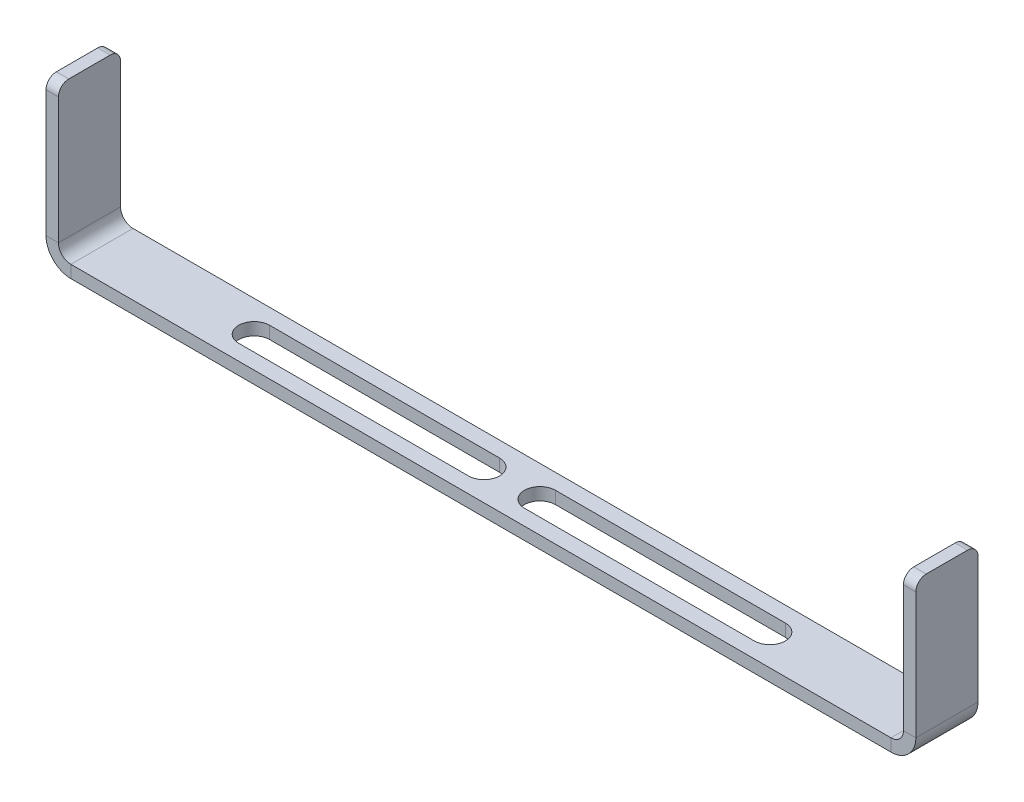
ISO-10303-21;
HEADER;
FILE_DESCRIPTION(('STEP AP214'),'2;1');
FILE_NAME('part.step','',(''),(''),'','','');
FILE_SCHEMA(('AUTOMOTIVE_DESIGN { 1 0 10303 214 1 1 1 1 }'));
ENDSEC;
DATA;
#1=APPLICATION_CONTEXT('core data for automotive mechanical design processes');
#2=APPLICATION_PROTOCOL_DEFINITION('international standard','automotive_design',2000,#1);
#3=PRODUCT_CONTEXT('',#1,'mechanical');
#4=PRODUCT('Part','Part','',(#3));
#5=PRODUCT_RELATED_PRODUCT_CATEGORY('part','',(#4));
#6=PRODUCT_DEFINITION_FORMATION('','',#4);
#7=PRODUCT_DEFINITION_CONTEXT('part definition',#1,'design');
#8=PRODUCT_DEFINITION('design','',#6,#7);
#9=PRODUCT_DEFINITION_SHAPE('','',#8);
#10=(LENGTH_UNIT() NAMED_UNIT(*) SI_UNIT(.MILLI.,.METRE.));
#11=(NAMED_UNIT(*) PLANE_ANGLE_UNIT() SI_UNIT($,.RADIAN.));
#12=(NAMED_UNIT(*) SI_UNIT($,.STERADIAN.) SOLID_ANGLE_UNIT());
#13=UNCERTAINTY_MEASURE_WITH_UNIT(LENGTH_MEASURE(1.E-05),#10,'distance_accuracy_value','');
#14=(GEOMETRIC_REPRESENTATION_CONTEXT(3) GLOBAL_UNCERTAINTY_ASSIGNED_CONTEXT((#13)) GLOBAL_UNIT_ASSIGNED_CONTEXT((#10,
#11,#12)) REPRESENTATION_CONTEXT('',''));
#15=CARTESIAN_POINT('',(0.,0.,0.));
#16=DIRECTION('',(0.,0.,1.));
#17=DIRECTION('',(1.,0.,0.));
#18=AXIS2_PLACEMENT_3D('',#15,#16,#17);
#19=CARTESIAN_POINT('',(-198.,0.,15.));
#20=DIRECTION('',(0.,0.,1.));
#21=DIRECTION('',(1.,0.,0.));
#22=AXIS2_PLACEMENT_3D('',#19,#20,#21);
#23=PLANE('',#22);
#24=DIRECTION('',(0.,-1.,0.));
#25=VECTOR('',#24,1.);
#26=CARTESIAN_POINT('',(-198.,0.,15.));
#27=LINE('',#26,#25);
#28=CARTESIAN_POINT('',(-198.,0.,15.));
#29=VERTEX_POINT('',#28);
#30=CARTESIAN_POINT('',(-198.,-6.00000000000005,15.));
#31=VERTEX_POINT('',#30);
#32=EDGE_CURVE('E377',#29,#31,#27,.T.);
#33=ORIENTED_EDGE('',*,*,#32,.F.);
#34=CARTESIAN_POINT('',(-198.,5.99999999999995,15.));
#35=DIRECTION('',(0.,0.,-1.));
#36=DIRECTION('',(-1.,0.,0.));
#37=AXIS2_PLACEMENT_3D('',#34,#35,#36);
#38=CIRCLE('',#37,6.);
#39=CARTESIAN_POINT('',(-204.,5.99999999999995,15.));
#40=VERTEX_POINT('',#39);
#41=EDGE_CURVE('E285',#40,#29,#38,.F.);
#42=ORIENTED_EDGE('',*,*,#41,.F.);
#43=DIRECTION('',(1.,0.,0.));
#44=VECTOR('',#43,1.);
#45=CARTESIAN_POINT('',(-210.,5.99999999999995,15.));
#46=LINE('',#45,#44);
#47=CARTESIAN_POINT('',(-210.,5.99999999999995,15.));
#48=VERTEX_POINT('',#47);
#49=EDGE_CURVE('E374',#48,#40,#46,.T.);
#50=ORIENTED_EDGE('',*,*,#49,.F.);
#51=CARTESIAN_POINT('',(-198.,5.99999999999995,15.));
#52=DIRECTION('',(0.,0.,1.));
#53=DIRECTION('',(1.,0.,0.));
#54=AXIS2_PLACEMENT_3D('',#51,#52,#53);
#55=CIRCLE('',#54,12.);
#56=EDGE_CURVE('E292',#48,#31,#55,.T.);
#57=ORIENTED_EDGE('',*,*,#56,.T.);
#58=EDGE_LOOP('',(#33,#42,#50,#57));
#59=FACE_BOUND('',#58,.T.);
#60=ADVANCED_FACE('F38',(#59),#23,.T.);
#61=CARTESIAN_POINT('',(-210.,5.99999999999995,15.));
#62=DIRECTION('',(0.,0.,1.));
#63=DIRECTION('',(1.,0.,0.));
#64=AXIS2_PLACEMENT_3D('',#61,#62,#63);
#65=PLANE('',#64);
#66=DIRECTION('',(1.,0.,0.));
#67=VECTOR('',#66,1.);
#68=CARTESIAN_POINT('',(204.,0.,15.));
#69=LINE('',#68,#67);
#70=CARTESIAN_POINT('',(198.,0.,15.));
#71=VERTEX_POINT('',#70);
#72=EDGE_CURVE('E282',#29,#71,#69,.T.);
#73=ORIENTED_EDGE('',*,*,#72,.F.);
#74=ORIENTED_EDGE('',*,*,#32,.T.);
#75=DIRECTION('',(1.,0.,0.));
#76=VECTOR('',#75,1.);
#77=CARTESIAN_POINT('',(204.,-6.00000000000005,15.));
#78=LINE('',#77,#76);
#79=CARTESIAN_POINT('',(198.,-6.00000000000005,15.));
#80=VERTEX_POINT('',#79);
#81=EDGE_CURVE('E295',#31,#80,#78,.T.);
#82=ORIENTED_EDGE('',*,*,#81,.T.);
#83=DIRECTION('',(0.,1.,0.));
#84=VECTOR('',#83,1.);
#85=CARTESIAN_POINT('',(198.,-6.00000000000005,15.));
#86=LINE('',#85,#84);
#87=EDGE_CURVE('E365',#80,#71,#86,.T.);
#88=ORIENTED_EDGE('',*,*,#87,.T.);
#89=EDGE_LOOP('',(#73,#74,#82,#88));
#90=FACE_BOUND('',#89,.T.);
#91=ADVANCED_FACE('F444',(#90),#65,.T.);
#92=CARTESIAN_POINT('',(-204.,5.99999999999995,-15.));
#93=DIRECTION('',(0.,0.,-1.));
#94=DIRECTION('',(-1.,0.,0.));
#95=AXIS2_PLACEMENT_3D('',#92,#93,#94);
#96=PLANE('',#95);
#97=DIRECTION('',(-1.,0.,0.));
#98=VECTOR('',#97,1.);
#99=CARTESIAN_POINT('',(-204.,5.99999999999995,-15.));
#100=LINE('',#99,#98);
#101=CARTESIAN_POINT('',(-204.,5.99999999999995,-15.));
#102=VERTEX_POINT('',#101);
#103=CARTESIAN_POINT('',(-210.,5.99999999999995,-15.));
#104=VERTEX_POINT('',#103);
#105=EDGE_CURVE('E371',#102,#104,#100,.T.);
#106=ORIENTED_EDGE('',*,*,#105,.F.);
#107=CARTESIAN_POINT('',(-198.,5.99999999999995,-15.));
#108=DIRECTION('',(0.,0.,-1.));
#109=DIRECTION('',(-1.,0.,0.));
#110=AXIS2_PLACEMENT_3D('',#107,#108,#109);
#111=CIRCLE('',#110,6.);
#112=CARTESIAN_POINT('',(-198.,0.,-15.));
#113=VERTEX_POINT('',#112);
#114=EDGE_CURVE('E313',#102,#113,#111,.F.);
#115=ORIENTED_EDGE('',*,*,#114,.T.);
#116=DIRECTION('',(0.,1.,0.));
#117=VECTOR('',#116,1.);
#118=CARTESIAN_POINT('',(-198.,-6.00000000000005,-15.));
#119=LINE('',#118,#117);
#120=CARTESIAN_POINT('',(-198.,-6.00000000000005,-15.));
#121=VERTEX_POINT('',#120);
#122=EDGE_CURVE('E369',#121,#113,#119,.T.);
#123=ORIENTED_EDGE('',*,*,#122,.F.);
#124=CARTESIAN_POINT('',(-198.,5.99999999999995,-15.));
#125=DIRECTION('',(0.,0.,1.));
#126=DIRECTION('',(1.,0.,0.));
#127=AXIS2_PLACEMENT_3D('',#124,#125,#126);
#128=CIRCLE('',#127,12.);
#129=EDGE_CURVE('E320',#104,#121,#128,.T.);
#130=ORIENTED_EDGE('',*,*,#129,.F.);
#131=EDGE_LOOP('',(#106,#115,#123,#130));
#132=FACE_BOUND('',#131,.T.);
#133=ADVANCED_FACE('F503',(#132),#96,.T.);
#134=CARTESIAN_POINT('',(-198.,-6.00000000000005,-15.));
#135=DIRECTION('',(0.,0.,-1.));
#136=DIRECTION('',(-1.,0.,0.));
#137=AXIS2_PLACEMENT_3D('',#134,#135,#136);
#138=PLANE('',#137);
#139=DIRECTION('',(0.,1.,0.));
#140=VECTOR('',#139,1.);
#141=CARTESIAN_POINT('',(-210.,0.,-15.));
#142=LINE('',#141,#140);
#143=CARTESIAN_POINT('',(-210.,66.9999999999999,-15.));
#144=VERTEX_POINT('',#143);
#145=EDGE_CURVE('E318',#144,#104,#142,.F.);
#146=ORIENTED_EDGE('',*,*,#145,.F.);
#147=DIRECTION('',(1.,0.,0.));
#148=VECTOR('',#147,1.);
#149=CARTESIAN_POINT('',(-198.,66.9999999999999,-15.));
#150=LINE('',#149,#148);
#151=CARTESIAN_POINT('',(-204.,66.9999999999999,-15.));
#152=VERTEX_POINT('',#151);
#153=EDGE_CURVE('E397',#144,#152,#150,.T.);
#154=ORIENTED_EDGE('',*,*,#153,.T.);
#155=DIRECTION('',(0.,-1.,0.));
#156=VECTOR('',#155,1.);
#157=CARTESIAN_POINT('',(-204.,0.,-15.));
#158=LINE('',#157,#156);
#159=EDGE_CURVE('E316',#152,#102,#158,.T.);
#160=ORIENTED_EDGE('',*,*,#159,.T.);
#161=ORIENTED_EDGE('',*,*,#105,.T.);
#162=EDGE_LOOP('',(#146,#154,#160,#161));
#163=FACE_BOUND('',#162,.T.);
#164=ADVANCED_FACE('F417',(#163),#138,.T.);
#165=CARTESIAN_POINT('',(204.,5.99999999999995,15.));
#166=DIRECTION('',(0.,0.,1.));
#167=DIRECTION('',(1.,0.,0.));
#168=AXIS2_PLACEMENT_3D('',#165,#166,#167);
#169=PLANE('',#168);
#170=DIRECTION('',(1.,0.,0.));
#171=VECTOR('',#170,1.);
#172=CARTESIAN_POINT('',(204.,5.99999999999995,15.));
#173=LINE('',#172,#171);
#174=CARTESIAN_POINT('',(204.,5.99999999999995,15.));
#175=VERTEX_POINT('',#174);
#176=CARTESIAN_POINT('',(210.,5.99999999999995,15.));
#177=VERTEX_POINT('',#176);
#178=EDGE_CURVE('E367',#175,#177,#173,.T.);
#179=ORIENTED_EDGE('',*,*,#178,.F.);
#180=CARTESIAN_POINT('',(198.,5.99999999999995,15.));
#181=DIRECTION('',(0.,0.,-1.));
#182=DIRECTION('',(-1.,0.,0.));
#183=AXIS2_PLACEMENT_3D('',#180,#181,#182);
#184=CIRCLE('',#183,6.);
#185=EDGE_CURVE('E279',#71,#175,#184,.F.);
#186=ORIENTED_EDGE('',*,*,#185,.F.);
#187=ORIENTED_EDGE('',*,*,#87,.F.);
#188=CARTESIAN_POINT('',(198.,5.99999999999995,15.));
#189=DIRECTION('',(0.,0.,1.));
#190=DIRECTION('',(1.,0.,0.));
#191=AXIS2_PLACEMENT_3D('',#188,#189,#190);
#192=CIRCLE('',#191,12.);
#193=EDGE_CURVE('E298',#80,#177,#192,.T.);
#194=ORIENTED_EDGE('',*,*,#193,.T.);
#195=EDGE_LOOP('',(#179,#186,#187,#194));
#196=FACE_BOUND('',#195,.T.);
#197=ADVANCED_FACE('F453',(#196),#169,.T.);
#198=CARTESIAN_POINT('',(198.,-6.00000000000005,15.));
#199=DIRECTION('',(0.,0.,1.));
#200=DIRECTION('',(1.,0.,0.));
#201=AXIS2_PLACEMENT_3D('',#198,#199,#200);
#202=PLANE('',#201);
#203=DIRECTION('',(0.,1.,0.));
#204=VECTOR('',#203,1.);
#205=CARTESIAN_POINT('',(210.,0.,15.));
#206=LINE('',#205,#204);
#207=CARTESIAN_POINT('',(210.,66.9999999999999,15.));
#208=VERTEX_POINT('',#207);
#209=EDGE_CURVE('E272',#177,#208,#206,.T.);
#210=ORIENTED_EDGE('',*,*,#209,.T.);
#211=DIRECTION('',(1.,0.,0.));
#212=VECTOR('',#211,1.);
#213=CARTESIAN_POINT('',(198.,66.9999999999999,15.));
#214=LINE('',#213,#212);
#215=CARTESIAN_POINT('',(204.,66.9999999999999,15.));
#216=VERTEX_POINT('',#215);
#217=EDGE_CURVE('E395',#208,#216,#214,.F.);
#218=ORIENTED_EDGE('',*,*,#217,.T.);
#219=DIRECTION('',(0.,1.,0.));
#220=VECTOR('',#219,1.);
#221=CARTESIAN_POINT('',(204.,0.,15.));
#222=LINE('',#221,#220);
#223=EDGE_CURVE('E275',#175,#216,#222,.T.);
#224=ORIENTED_EDGE('',*,*,#223,.F.);
#225=ORIENTED_EDGE('',*,*,#178,.T.);
#226=EDGE_LOOP('',(#210,#218,#224,#225));
#227=FACE_BOUND('',#226,.T.);
#228=ADVANCED_FACE('F463',(#227),#202,.T.);
#229=CARTESIAN_POINT('',(198.,0.,-15.));
#230=DIRECTION('',(0.,0.,-1.));
#231=DIRECTION('',(-1.,0.,0.));
#232=AXIS2_PLACEMENT_3D('',#229,#230,#231);
#233=PLANE('',#232);
#234=DIRECTION('',(0.,-1.,0.));
#235=VECTOR('',#234,1.);
#236=CARTESIAN_POINT('',(198.,0.,-15.));
#237=LINE('',#236,#235);
#238=CARTESIAN_POINT('',(198.,0.,-15.));
#239=VERTEX_POINT('',#238);
#240=CARTESIAN_POINT('',(198.,-6.00000000000005,-15.));
#241=VERTEX_POINT('',#240);
#242=EDGE_CURVE('E363',#239,#241,#237,.T.);
#243=ORIENTED_EDGE('',*,*,#242,.F.);
#244=CARTESIAN_POINT('',(198.,5.99999999999995,-15.));
#245=DIRECTION('',(0.,0.,-1.));
#246=DIRECTION('',(-1.,0.,0.));
#247=AXIS2_PLACEMENT_3D('',#244,#245,#246);
#248=CIRCLE('',#247,6.);
#249=CARTESIAN_POINT('',(204.,5.99999999999995,-15.));
#250=VERTEX_POINT('',#249);
#251=EDGE_CURVE('E307',#239,#250,#248,.F.);
#252=ORIENTED_EDGE('',*,*,#251,.T.);
#253=DIRECTION('',(-1.,0.,0.));
#254=VECTOR('',#253,1.);
#255=CARTESIAN_POINT('',(210.,5.99999999999995,-15.));
#256=LINE('',#255,#254);
#257=CARTESIAN_POINT('',(210.,5.99999999999995,-15.));
#258=VERTEX_POINT('',#257);
#259=EDGE_CURVE('E361',#258,#250,#256,.T.);
#260=ORIENTED_EDGE('',*,*,#259,.F.);
#261=CARTESIAN_POINT('',(198.,5.99999999999995,-15.));
#262=DIRECTION('',(0.,0.,1.));
#263=DIRECTION('',(1.,0.,0.));
#264=AXIS2_PLACEMENT_3D('',#261,#262,#263);
#265=CIRCLE('',#264,12.);
#266=EDGE_CURVE('E276',#241,#258,#265,.T.);
#267=ORIENTED_EDGE('',*,*,#266,.F.);
#268=EDGE_LOOP('',(#243,#252,#260,#267));
#269=FACE_BOUND('',#268,.T.);
#270=ADVANCED_FACE('F483',(#269),#233,.T.);
#271=CARTESIAN_POINT('',(210.,5.99999999999995,-15.));
#272=DIRECTION('',(0.,0.,-1.));
#273=DIRECTION('',(-1.,0.,0.));
#274=AXIS2_PLACEMENT_3D('',#271,#272,#273);
#275=PLANE('',#274);
#276=DIRECTION('',(1.,0.,0.));
#277=VECTOR('',#276,1.);
#278=CARTESIAN_POINT('',(204.,0.,-15.));
#279=LINE('',#278,#277);
#280=EDGE_CURVE('E310',#113,#239,#279,.T.);
#281=ORIENTED_EDGE('',*,*,#280,.T.);
#282=ORIENTED_EDGE('',*,*,#242,.T.);
#283=DIRECTION('',(1.,0.,0.));
#284=VECTOR('',#283,1.);
#285=CARTESIAN_POINT('',(204.,-6.00000000000005,-15.));
#286=LINE('',#285,#284);
#287=EDGE_CURVE('E323',#121,#241,#286,.T.);
#288=ORIENTED_EDGE('',*,*,#287,.F.);
#289=ORIENTED_EDGE('',*,*,#122,.T.);
#290=EDGE_LOOP('',(#281,#282,#288,#289));
#291=FACE_BOUND('',#290,.T.);
#292=ADVANCED_FACE('F489',(#291),#275,.T.);
#293=CARTESIAN_POINT('',(210.,0.,15.));
#294=DIRECTION('',(-1.,0.,0.));
#295=DIRECTION('',(0.,0.,1.));
#296=AXIS2_PLACEMENT_3D('',#293,#294,#295);
#297=PLANE('',#296);
#298=DIRECTION('',(0.,1.,0.));
#299=VECTOR('',#298,1.);
#300=CARTESIAN_POINT('',(210.,0.,-15.));
#301=LINE('',#300,#299);
#302=CARTESIAN_POINT('',(210.,66.9999999999999,-15.));
#303=VERTEX_POINT('',#302);
#304=EDGE_CURVE('E271',#258,#303,#301,.T.);
#305=ORIENTED_EDGE('',*,*,#304,.T.);
#306=CARTESIAN_POINT('',(210.,66.9999999999999,-10.));
#307=DIRECTION('',(-1.,0.,0.));
#308=DIRECTION('',(0.,0.,1.));
#309=AXIS2_PLACEMENT_3D('',#306,#307,#308);
#310=CIRCLE('',#309,5.);
#311=CARTESIAN_POINT('',(210.,71.9999999999999,-10.));
#312=VERTEX_POINT('',#311);
#313=EDGE_CURVE('E384',#303,#312,#310,.F.);
#314=ORIENTED_EDGE('',*,*,#313,.T.);
#315=DIRECTION('',(0.,0.,-1.));
#316=VECTOR('',#315,1.);
#317=CARTESIAN_POINT('',(210.,71.9999999999999,15.));
#318=LINE('',#317,#316);
#319=CARTESIAN_POINT('',(210.,71.9999999999999,10.));
#320=VERTEX_POINT('',#319);
#321=EDGE_CURVE('E358',#320,#312,#318,.T.);
#322=ORIENTED_EDGE('',*,*,#321,.F.);
#323=CARTESIAN_POINT('',(210.,66.9999999999999,10.));
#324=DIRECTION('',(-1.,0.,0.));
#325=DIRECTION('',(0.,0.,1.));
#326=AXIS2_PLACEMENT_3D('',#323,#324,#325);
#327=CIRCLE('',#326,5.);
#328=EDGE_CURVE('E382',#320,#208,#327,.F.);
#329=ORIENTED_EDGE('',*,*,#328,.T.);
#330=ORIENTED_EDGE('',*,*,#209,.F.);
#331=DIRECTION('',(0.,0.,-1.));
#332=VECTOR('',#331,1.);
#333=CARTESIAN_POINT('',(210.,5.99999999999995,15.));
#334=LINE('',#333,#332);
#335=EDGE_CURVE('E301',#177,#258,#334,.T.);
#336=ORIENTED_EDGE('',*,*,#335,.T.);
#337=EDGE_LOOP('',(#305,#314,#322,#329,#330,#336));
#338=FACE_BOUND('',#337,.T.);
#339=ADVANCED_FACE('F487',(#338),#297,.F.);
#340=CARTESIAN_POINT('',(204.,71.9999999999999,15.));
#341=DIRECTION('',(0.,1.,0.));
#342=DIRECTION('',(0.,0.,1.));
#343=AXIS2_PLACEMENT_3D('',#340,#341,#342);
#344=PLANE('',#343);
#345=ORIENTED_EDGE('',*,*,#321,.T.);
#346=DIRECTION('',(1.,0.,0.));
#347=VECTOR('',#346,1.);
#348=CARTESIAN_POINT('',(204.,71.9999999999999,-10.));
#349=LINE('',#348,#347);
#350=CARTESIAN_POINT('',(204.,71.9999999999999,-10.));
#351=VERTEX_POINT('',#350);
#352=EDGE_CURVE('E389',#312,#351,#349,.F.);
#353=ORIENTED_EDGE('',*,*,#352,.T.);
#354=DIRECTION('',(0.,0.,-1.));
#355=VECTOR('',#354,1.);
#356=CARTESIAN_POINT('',(204.,71.9999999999999,15.));
#357=LINE('',#356,#355);
#358=CARTESIAN_POINT('',(204.,71.9999999999999,10.));
#359=VERTEX_POINT('',#358);
#360=EDGE_CURVE('E355',#359,#351,#357,.T.);
#361=ORIENTED_EDGE('',*,*,#360,.F.);
#362=DIRECTION('',(1.,0.,0.));
#363=VECTOR('',#362,1.);
#364=CARTESIAN_POINT('',(204.,71.9999999999999,10.));
#365=LINE('',#364,#363);
#366=EDGE_CURVE('E386',#359,#320,#365,.T.);
#367=ORIENTED_EDGE('',*,*,#366,.T.);
#368=EDGE_LOOP('',(#345,#353,#361,#367));
#369=FACE_BOUND('',#368,.T.);
#370=ADVANCED_FACE('F472',(#369),#344,.T.);
#371=CARTESIAN_POINT('',(204.,0.,15.));
#372=DIRECTION('',(-1.,0.,0.));
#373=DIRECTION('',(0.,0.,1.));
#374=AXIS2_PLACEMENT_3D('',#371,#372,#373);
#375=PLANE('',#374);
#376=ORIENTED_EDGE('',*,*,#360,.T.);
#377=CARTESIAN_POINT('',(204.,66.9999999999999,-10.));
#378=DIRECTION('',(-1.,0.,0.));
#379=DIRECTION('',(0.,0.,1.));
#380=AXIS2_PLACEMENT_3D('',#377,#378,#379);
#381=CIRCLE('',#380,5.);
#382=CARTESIAN_POINT('',(204.,66.9999999999999,-15.));
#383=VERTEX_POINT('',#382);
#384=EDGE_CURVE('E393',#351,#383,#381,.T.);
#385=ORIENTED_EDGE('',*,*,#384,.T.);
#386=DIRECTION('',(0.,1.,0.));
#387=VECTOR('',#386,1.);
#388=CARTESIAN_POINT('',(204.,0.,-15.));
#389=LINE('',#388,#387);
#390=EDGE_CURVE('E304',#250,#383,#389,.T.);
#391=ORIENTED_EDGE('',*,*,#390,.F.);
#392=DIRECTION('',(0.,0.,-1.));
#393=VECTOR('',#392,1.);
#394=CARTESIAN_POINT('',(204.,5.99999999999995,15.));
#395=LINE('',#394,#393);
#396=EDGE_CURVE('E352',#175,#250,#395,.T.);
#397=ORIENTED_EDGE('',*,*,#396,.F.);
#398=ORIENTED_EDGE('',*,*,#223,.T.);
#399=CARTESIAN_POINT('',(204.,66.9999999999999,10.));
#400=DIRECTION('',(-1.,0.,0.));
#401=DIRECTION('',(0.,0.,1.));
#402=AXIS2_PLACEMENT_3D('',#399,#400,#401);
#403=CIRCLE('',#402,5.);
#404=EDGE_CURVE('E391',#216,#359,#403,.T.);
#405=ORIENTED_EDGE('',*,*,#404,.T.);
#406=EDGE_LOOP('',(#376,#385,#391,#397,#398,#405));
#407=FACE_BOUND('',#406,.T.);
#408=ADVANCED_FACE('F461',(#407),#375,.T.);
#409=CARTESIAN_POINT('',(198.,5.99999999999995,15.));
#410=DIRECTION('',(0.,0.,-1.));
#411=DIRECTION('',(-1.,0.,0.));
#412=AXIS2_PLACEMENT_3D('',#409,#410,#411);
#413=CYLINDRICAL_SURFACE('',#412,6.);
#414=ORIENTED_EDGE('',*,*,#251,.F.);
#415=DIRECTION('',(0.,0.,-1.));
#416=VECTOR('',#415,1.);
#417=CARTESIAN_POINT('',(198.,0.,15.));
#418=LINE('',#417,#416);
#419=EDGE_CURVE('E349',#71,#239,#418,.T.);
#420=ORIENTED_EDGE('',*,*,#419,.F.);
#421=ORIENTED_EDGE('',*,*,#185,.T.);
#422=ORIENTED_EDGE('',*,*,#396,.T.);
#423=EDGE_LOOP('',(#414,#420,#421,#422));
#424=FACE_BOUND('',#423,.T.);
#425=ADVANCED_FACE('F452',(#424),#413,.F.);
#426=CARTESIAN_POINT('',(204.,0.,15.));
#427=DIRECTION('',(0.,1.,0.));
#428=DIRECTION('',(0.,0.,1.));
#429=AXIS2_PLACEMENT_3D('',#426,#427,#428);
#430=PLANE('',#429);
#431=CARTESIAN_POINT('',(13.5,0.,0.));
#432=DIRECTION('',(0.,1.,0.));
#433=DIRECTION('',(0.,0.,1.));
#434=AXIS2_PLACEMENT_3D('',#431,#432,#433);
#435=CIRCLE('',#434,7.5);
#436=CARTESIAN_POINT('',(13.5,0.,-7.5));
#437=VERTEX_POINT('',#436);
#438=CARTESIAN_POINT('',(13.5,0.,7.5));
#439=VERTEX_POINT('',#438);
#440=EDGE_CURVE('E269',#437,#439,#435,.T.);
#441=ORIENTED_EDGE('',*,*,#440,.F.);
#442=DIRECTION('',(-1.,0.,0.));
#443=VECTOR('',#442,1.);
#444=CARTESIAN_POINT('',(204.,0.,-7.5));
#445=LINE('',#444,#443);
#446=CARTESIAN_POINT('',(124.5,0.,-7.5));
#447=VERTEX_POINT('',#446);
#448=EDGE_CURVE('E264',#447,#437,#445,.T.);
#449=ORIENTED_EDGE('',*,*,#448,.F.);
#450=CARTESIAN_POINT('',(124.5,0.,0.));
#451=DIRECTION('',(0.,1.,0.));
#452=DIRECTION('',(0.,0.,1.));
#453=AXIS2_PLACEMENT_3D('',#450,#451,#452);
#454=CIRCLE('',#453,7.5);
#455=CARTESIAN_POINT('',(124.5,0.,7.5));
#456=VERTEX_POINT('',#455);
#457=EDGE_CURVE('E208',#456,#447,#454,.T.);
#458=ORIENTED_EDGE('',*,*,#457,.F.);
#459=DIRECTION('',(1.,0.,0.));
#460=VECTOR('',#459,1.);
#461=CARTESIAN_POINT('',(204.,0.,7.5));
#462=LINE('',#461,#460);
#463=EDGE_CURVE('E267',#439,#456,#462,.T.);
#464=ORIENTED_EDGE('',*,*,#463,.F.);
#465=EDGE_LOOP('',(#441,#449,#458,#464));
#466=FACE_BOUND('',#465,.T.);
#467=CARTESIAN_POINT('',(-13.5,0.,0.));
#468=DIRECTION('',(0.,1.,0.));
#469=DIRECTION('',(0.,0.,1.));
#470=AXIS2_PLACEMENT_3D('',#467,#468,#469);
#471=CIRCLE('',#470,7.5);
#472=CARTESIAN_POINT('',(-13.5,0.,7.5));
#473=VERTEX_POINT('',#472);
#474=CARTESIAN_POINT('',(-13.5,0.,-7.5));
#475=VERTEX_POINT('',#474);
#476=EDGE_CURVE('E262',#473,#475,#471,.T.);
#477=ORIENTED_EDGE('',*,*,#476,.F.);
#478=DIRECTION('',(1.,0.,0.));
#479=VECTOR('',#478,1.);
#480=CARTESIAN_POINT('',(204.,0.,7.5));
#481=LINE('',#480,#479);
#482=CARTESIAN_POINT('',(-124.5,0.,7.5));
#483=VERTEX_POINT('',#482);
#484=EDGE_CURVE('E233',#483,#473,#481,.T.);
#485=ORIENTED_EDGE('',*,*,#484,.F.);
#486=CARTESIAN_POINT('',(-124.5,0.,0.));
#487=DIRECTION('',(0.,1.,0.));
#488=DIRECTION('',(0.,0.,1.));
#489=AXIS2_PLACEMENT_3D('',#486,#487,#488);
#490=CIRCLE('',#489,7.5);
#491=CARTESIAN_POINT('',(-124.5,0.,-7.5));
#492=VERTEX_POINT('',#491);
#493=EDGE_CURVE('E257',#492,#483,#490,.T.);
#494=ORIENTED_EDGE('',*,*,#493,.F.);
#495=DIRECTION('',(-1.,0.,0.));
#496=VECTOR('',#495,1.);
#497=CARTESIAN_POINT('',(204.,0.,-7.5));
#498=LINE('',#497,#496);
#499=EDGE_CURVE('E260',#475,#492,#498,.T.);
#500=ORIENTED_EDGE('',*,*,#499,.F.);
#501=EDGE_LOOP('',(#477,#485,#494,#500));
#502=FACE_BOUND('',#501,.T.);
#503=ORIENTED_EDGE('',*,*,#280,.F.);
#504=DIRECTION('',(0.,0.,-1.));
#505=VECTOR('',#504,1.);
#506=CARTESIAN_POINT('',(-198.,0.,15.));
#507=LINE('',#506,#505);
#508=EDGE_CURVE('E346',#29,#113,#507,.T.);
#509=ORIENTED_EDGE('',*,*,#508,.F.);
#510=ORIENTED_EDGE('',*,*,#72,.T.);
#511=ORIENTED_EDGE('',*,*,#419,.T.);
#512=EDGE_LOOP('',(#503,#509,#510,#511));
#513=FACE_BOUND('',#512,.T.);
#514=ADVANCED_FACE('F443',(#466,#502,#513),#430,.T.);
#515=CARTESIAN_POINT('',(-198.,5.99999999999995,15.));
#516=DIRECTION('',(0.,0.,-1.));
#517=DIRECTION('',(-1.,0.,0.));
#518=AXIS2_PLACEMENT_3D('',#515,#516,#517);
#519=CYLINDRICAL_SURFACE('',#518,6.);
#520=ORIENTED_EDGE('',*,*,#114,.F.);
#521=DIRECTION('',(0.,0.,-1.));
#522=VECTOR('',#521,1.);
#523=CARTESIAN_POINT('',(-204.,5.99999999999995,15.));
#524=LINE('',#523,#522);
#525=EDGE_CURVE('E343',#40,#102,#524,.T.);
#526=ORIENTED_EDGE('',*,*,#525,.F.);
#527=ORIENTED_EDGE('',*,*,#41,.T.);
#528=ORIENTED_EDGE('',*,*,#508,.T.);
#529=EDGE_LOOP('',(#520,#526,#527,#528));
#530=FACE_BOUND('',#529,.T.);
#531=ADVANCED_FACE('F435',(#530),#519,.F.);
#532=CARTESIAN_POINT('',(-204.,0.,15.));
#533=DIRECTION('',(1.,0.,0.));
#534=DIRECTION('',(0.,0.,-1.));
#535=AXIS2_PLACEMENT_3D('',#532,#533,#534);
#536=PLANE('',#535);
#537=ORIENTED_EDGE('',*,*,#159,.F.);
#538=CARTESIAN_POINT('',(-204.,66.9999999999999,-10.));
#539=DIRECTION('',(1.,0.,0.));
#540=DIRECTION('',(0.,0.,-1.));
#541=AXIS2_PLACEMENT_3D('',#538,#539,#540);
#542=CIRCLE('',#541,5.);
#543=CARTESIAN_POINT('',(-204.,71.9999999999999,-10.));
#544=VERTEX_POINT('',#543);
#545=EDGE_CURVE('E402',#152,#544,#542,.T.);
#546=ORIENTED_EDGE('',*,*,#545,.T.);
#547=DIRECTION('',(0.,0.,-1.));
#548=VECTOR('',#547,1.);
#549=CARTESIAN_POINT('',(-204.,71.9999999999999,15.));
#550=LINE('',#549,#548);
#551=CARTESIAN_POINT('',(-204.,71.9999999999999,10.));
#552=VERTEX_POINT('',#551);
#553=EDGE_CURVE('E341',#552,#544,#550,.T.);
#554=ORIENTED_EDGE('',*,*,#553,.F.);
#555=CARTESIAN_POINT('',(-204.,66.9999999999999,10.));
#556=DIRECTION('',(1.,0.,0.));
#557=DIRECTION('',(0.,0.,-1.));
#558=AXIS2_PLACEMENT_3D('',#555,#556,#557);
#559=CIRCLE('',#558,5.);
#560=CARTESIAN_POINT('',(-204.,66.9999999999999,15.));
#561=VERTEX_POINT('',#560);
#562=EDGE_CURVE('E400',#552,#561,#559,.T.);
#563=ORIENTED_EDGE('',*,*,#562,.T.);
#564=DIRECTION('',(0.,-1.,0.));
#565=VECTOR('',#564,1.);
#566=CARTESIAN_POINT('',(-204.,0.,15.));
#567=LINE('',#566,#565);
#568=EDGE_CURVE('E288',#561,#40,#567,.T.);
#569=ORIENTED_EDGE('',*,*,#568,.T.);
#570=ORIENTED_EDGE('',*,*,#525,.T.);
#571=EDGE_LOOP('',(#537,#546,#554,#563,#569,#570));
#572=FACE_BOUND('',#571,.T.);
#573=ADVANCED_FACE('F423',(#572),#536,.T.);
#574=CARTESIAN_POINT('',(-210.,71.9999999999999,15.));
#575=DIRECTION('',(0.,1.,0.));
#576=DIRECTION('',(0.,0.,1.));
#577=AXIS2_PLACEMENT_3D('',#574,#575,#576);
#578=PLANE('',#577);
#579=ORIENTED_EDGE('',*,*,#553,.T.);
#580=DIRECTION('',(1.,0.,0.));
#581=VECTOR('',#580,1.);
#582=CARTESIAN_POINT('',(-210.,71.9999999999999,-10.));
#583=LINE('',#582,#581);
#584=CARTESIAN_POINT('',(-210.,71.9999999999999,-10.));
#585=VERTEX_POINT('',#584);
#586=EDGE_CURVE('E59',#544,#585,#583,.F.);
#587=ORIENTED_EDGE('',*,*,#586,.T.);
#588=DIRECTION('',(0.,0.,-1.));
#589=VECTOR('',#588,1.);
#590=CARTESIAN_POINT('',(-210.,71.9999999999999,15.));
#591=LINE('',#590,#589);
#592=CARTESIAN_POINT('',(-210.,71.9999999999999,10.));
#593=VERTEX_POINT('',#592);
#594=EDGE_CURVE('E339',#593,#585,#591,.T.);
#595=ORIENTED_EDGE('',*,*,#594,.F.);
#596=DIRECTION('',(1.,0.,0.));
#597=VECTOR('',#596,1.);
#598=CARTESIAN_POINT('',(-204.,71.9999999999999,10.));
#599=LINE('',#598,#597);
#600=EDGE_CURVE('E404',#593,#552,#599,.T.);
#601=ORIENTED_EDGE('',*,*,#600,.T.);
#602=EDGE_LOOP('',(#579,#587,#595,#601));
#603=FACE_BOUND('',#602,.T.);
#604=ADVANCED_FACE('F424',(#603),#578,.T.);
#605=CARTESIAN_POINT('',(-210.,0.,15.));
#606=DIRECTION('',(1.,0.,0.));
#607=DIRECTION('',(0.,0.,-1.));
#608=AXIS2_PLACEMENT_3D('',#605,#606,#607);
#609=PLANE('',#608);
#610=ORIENTED_EDGE('',*,*,#594,.T.);
#611=CARTESIAN_POINT('',(-210.,66.9999999999999,-10.));
#612=DIRECTION('',(1.,0.,0.));
#613=DIRECTION('',(0.,0.,-1.));
#614=AXIS2_PLACEMENT_3D('',#611,#612,#613);
#615=CIRCLE('',#614,5.);
#616=EDGE_CURVE('E46',#585,#144,#615,.F.);
#617=ORIENTED_EDGE('',*,*,#616,.T.);
#618=ORIENTED_EDGE('',*,*,#145,.T.);
#619=DIRECTION('',(0.,0.,-1.));
#620=VECTOR('',#619,1.);
#621=CARTESIAN_POINT('',(-210.,5.99999999999995,15.));
#622=LINE('',#621,#620);
#623=EDGE_CURVE('E336',#48,#104,#622,.T.);
#624=ORIENTED_EDGE('',*,*,#623,.F.);
#625=DIRECTION('',(0.,1.,0.));
#626=VECTOR('',#625,1.);
#627=CARTESIAN_POINT('',(-210.,0.,15.));
#628=LINE('',#627,#626);
#629=CARTESIAN_POINT('',(-210.,66.9999999999999,15.));
#630=VERTEX_POINT('',#629);
#631=EDGE_CURVE('E290',#630,#48,#628,.F.);
#632=ORIENTED_EDGE('',*,*,#631,.F.);
#633=CARTESIAN_POINT('',(-210.,66.9999999999999,10.));
#634=DIRECTION('',(1.,0.,0.));
#635=DIRECTION('',(0.,0.,-1.));
#636=AXIS2_PLACEMENT_3D('',#633,#634,#635);
#637=CIRCLE('',#636,5.);
#638=EDGE_CURVE('E408',#630,#593,#637,.F.);
#639=ORIENTED_EDGE('',*,*,#638,.T.);
#640=EDGE_LOOP('',(#610,#617,#618,#624,#632,#639));
#641=FACE_BOUND('',#640,.T.);
#642=ADVANCED_FACE('F412',(#641),#609,.F.);
#643=CARTESIAN_POINT('',(-198.,5.99999999999995,15.));
#644=DIRECTION('',(0.,0.,-1.));
#645=DIRECTION('',(-1.,0.,0.));
#646=AXIS2_PLACEMENT_3D('',#643,#644,#645);
#647=CYLINDRICAL_SURFACE('',#646,12.);
#648=ORIENTED_EDGE('',*,*,#129,.T.);
#649=DIRECTION('',(0.,0.,-1.));
#650=VECTOR('',#649,1.);
#651=CARTESIAN_POINT('',(-198.,-6.00000000000005,15.));
#652=LINE('',#651,#650);
#653=EDGE_CURVE('E333',#31,#121,#652,.T.);
#654=ORIENTED_EDGE('',*,*,#653,.F.);
#655=ORIENTED_EDGE('',*,*,#56,.F.);
#656=ORIENTED_EDGE('',*,*,#623,.T.);
#657=EDGE_LOOP('',(#648,#654,#655,#656));
#658=FACE_BOUND('',#657,.T.);
#659=ADVANCED_FACE('F566',(#658),#647,.T.);
#660=CARTESIAN_POINT('',(204.,-6.00000000000005,15.));
#661=DIRECTION('',(0.,1.,0.));
#662=DIRECTION('',(0.,0.,1.));
#663=AXIS2_PLACEMENT_3D('',#660,#661,#662);
#664=PLANE('',#663);
#665=DIRECTION('',(1.,0.,0.));
#666=VECTOR('',#665,1.);
#667=CARTESIAN_POINT('',(13.5,-6.00000000000005,-7.5));
#668=LINE('',#667,#666);
#669=CARTESIAN_POINT('',(13.5,-6.00000000000005,-7.5));
#670=VERTEX_POINT('',#669);
#671=CARTESIAN_POINT('',(124.5,-6.00000000000005,-7.5));
#672=VERTEX_POINT('',#671);
#673=EDGE_CURVE('E216',#670,#672,#668,.T.);
#674=ORIENTED_EDGE('',*,*,#673,.F.);
#675=CARTESIAN_POINT('',(13.5,-6.00000000000005,0.));
#676=DIRECTION('',(0.,-1.,0.));
#677=DIRECTION('',(0.,0.,-1.));
#678=AXIS2_PLACEMENT_3D('',#675,#676,#677);
#679=CIRCLE('',#678,7.5);
#680=CARTESIAN_POINT('',(13.5,-6.00000000000005,7.5));
#681=VERTEX_POINT('',#680);
#682=EDGE_CURVE('E221',#681,#670,#679,.T.);
#683=ORIENTED_EDGE('',*,*,#682,.F.);
#684=DIRECTION('',(-1.,0.,0.));
#685=VECTOR('',#684,1.);
#686=CARTESIAN_POINT('',(13.5,-6.00000000000005,7.5));
#687=LINE('',#686,#685);
#688=CARTESIAN_POINT('',(124.5,-6.00000000000005,7.5));
#689=VERTEX_POINT('',#688);
#690=EDGE_CURVE('E226',#689,#681,#687,.T.);
#691=ORIENTED_EDGE('',*,*,#690,.F.);
#692=CARTESIAN_POINT('',(124.5,-6.00000000000005,0.));
#693=DIRECTION('',(0.,-1.,0.));
#694=DIRECTION('',(0.,0.,-1.));
#695=AXIS2_PLACEMENT_3D('',#692,#693,#694);
#696=CIRCLE('',#695,7.5);
#697=EDGE_CURVE('E205',#672,#689,#696,.T.);
#698=ORIENTED_EDGE('',*,*,#697,.F.);
#699=EDGE_LOOP('',(#674,#683,#691,#698));
#700=FACE_BOUND('',#699,.T.);
#701=DIRECTION('',(-1.,0.,0.));
#702=VECTOR('',#701,1.);
#703=CARTESIAN_POINT('',(-13.5,-6.00000000000005,7.5));
#704=LINE('',#703,#702);
#705=CARTESIAN_POINT('',(-13.5,-6.00000000000005,7.5));
#706=VERTEX_POINT('',#705);
#707=CARTESIAN_POINT('',(-124.5,-6.00000000000005,7.5));
#708=VERTEX_POINT('',#707);
#709=EDGE_CURVE('E238',#706,#708,#704,.T.);
#710=ORIENTED_EDGE('',*,*,#709,.F.);
#711=CARTESIAN_POINT('',(-13.5,-6.00000000000005,0.));
#712=DIRECTION('',(0.,-1.,0.));
#713=DIRECTION('',(0.,0.,1.));
#714=AXIS2_PLACEMENT_3D('',#711,#712,#713);
#715=CIRCLE('',#714,7.5);
#716=CARTESIAN_POINT('',(-13.5,-6.00000000000005,-7.5));
#717=VERTEX_POINT('',#716);
#718=EDGE_CURVE('E236',#717,#706,#715,.T.);
#719=ORIENTED_EDGE('',*,*,#718,.F.);
#720=DIRECTION('',(1.,0.,0.));
#721=VECTOR('',#720,1.);
#722=CARTESIAN_POINT('',(-13.5,-6.00000000000005,-7.5));
#723=LINE('',#722,#721);
#724=CARTESIAN_POINT('',(-124.5,-6.00000000000005,-7.5));
#725=VERTEX_POINT('',#724);
#726=EDGE_CURVE('E244',#725,#717,#723,.T.);
#727=ORIENTED_EDGE('',*,*,#726,.F.);
#728=CARTESIAN_POINT('',(-124.5,-6.00000000000005,0.));
#729=DIRECTION('',(0.,-1.,0.));
#730=DIRECTION('',(0.,0.,1.));
#731=AXIS2_PLACEMENT_3D('',#728,#729,#730);
#732=CIRCLE('',#731,7.5);
#733=EDGE_CURVE('E241',#708,#725,#732,.T.);
#734=ORIENTED_EDGE('',*,*,#733,.F.);
#735=EDGE_LOOP('',(#710,#719,#727,#734));
#736=FACE_BOUND('',#735,.T.);
#737=ORIENTED_EDGE('',*,*,#287,.T.);
#738=DIRECTION('',(0.,0.,-1.));
#739=VECTOR('',#738,1.);
#740=CARTESIAN_POINT('',(198.,-6.00000000000005,15.));
#741=LINE('',#740,#739);
#742=EDGE_CURVE('E330',#80,#241,#741,.T.);
#743=ORIENTED_EDGE('',*,*,#742,.F.);
#744=ORIENTED_EDGE('',*,*,#81,.F.);
#745=ORIENTED_EDGE('',*,*,#653,.T.);
#746=EDGE_LOOP('',(#737,#743,#744,#745));
#747=FACE_BOUND('',#746,.T.);
#748=ADVANCED_FACE('F223',(#700,#736,#747),#664,.F.);
#749=CARTESIAN_POINT('',(198.,5.99999999999995,15.));
#750=DIRECTION('',(0.,0.,-1.));
#751=DIRECTION('',(-1.,0.,0.));
#752=AXIS2_PLACEMENT_3D('',#749,#750,#751);
#753=CYLINDRICAL_SURFACE('',#752,12.);
#754=ORIENTED_EDGE('',*,*,#266,.T.);
#755=ORIENTED_EDGE('',*,*,#335,.F.);
#756=ORIENTED_EDGE('',*,*,#193,.F.);
#757=ORIENTED_EDGE('',*,*,#742,.T.);
#758=EDGE_LOOP('',(#754,#755,#756,#757));
#759=FACE_BOUND('',#758,.T.);
#760=ADVANCED_FACE('F485',(#759),#753,.T.);
#761=CARTESIAN_POINT('',(198.,5.99999999999995,15.));
#762=DIRECTION('',(0.,0.,-1.));
#763=DIRECTION('',(-1.,0.,0.));
#764=AXIS2_PLACEMENT_3D('',#761,#762,#763);
#765=PLANE('',#764);
#766=ORIENTED_EDGE('',*,*,#568,.F.);
#767=DIRECTION('',(1.,0.,0.));
#768=VECTOR('',#767,1.);
#769=CARTESIAN_POINT('',(-210.,66.9999999999999,15.));
#770=LINE('',#769,#768);
#771=EDGE_CURVE('E11',#561,#630,#770,.F.);
#772=ORIENTED_EDGE('',*,*,#771,.T.);
#773=ORIENTED_EDGE('',*,*,#631,.T.);
#774=ORIENTED_EDGE('',*,*,#49,.T.);
#775=EDGE_LOOP('',(#766,#772,#773,#774));
#776=FACE_BOUND('',#775,.T.);
#777=ADVANCED_FACE('F428',(#776),#765,.F.);
#778=CARTESIAN_POINT('',(198.,5.99999999999995,-15.));
#779=DIRECTION('',(0.,0.,-1.));
#780=DIRECTION('',(-1.,0.,0.));
#781=AXIS2_PLACEMENT_3D('',#778,#779,#780);
#782=PLANE('',#781);
#783=ORIENTED_EDGE('',*,*,#390,.T.);
#784=DIRECTION('',(1.,0.,0.));
#785=VECTOR('',#784,1.);
#786=CARTESIAN_POINT('',(198.,66.9999999999999,-15.));
#787=LINE('',#786,#785);
#788=EDGE_CURVE('E379',#383,#303,#787,.T.);
#789=ORIENTED_EDGE('',*,*,#788,.T.);
#790=ORIENTED_EDGE('',*,*,#304,.F.);
#791=ORIENTED_EDGE('',*,*,#259,.T.);
#792=EDGE_LOOP('',(#783,#789,#790,#791));
#793=FACE_BOUND('',#792,.T.);
#794=ADVANCED_FACE('F479',(#793),#782,.T.);
#795=CARTESIAN_POINT('',(-13.5,3.99999999999995,0.));
#796=DIRECTION('',(0.,-1.,0.));
#797=DIRECTION('',(0.,0.,-1.));
#798=AXIS2_PLACEMENT_3D('',#795,#796,#797);
#799=CYLINDRICAL_SURFACE('',#798,7.5);
#800=ORIENTED_EDGE('',*,*,#476,.T.);
#801=DIRECTION('',(0.,-1.,0.));
#802=VECTOR('',#801,1.);
#803=CARTESIAN_POINT('',(-13.5,3.99999999999995,-7.5));
#804=LINE('',#803,#802);
#805=EDGE_CURVE('E248',#475,#717,#804,.T.);
#806=ORIENTED_EDGE('',*,*,#805,.T.);
#807=ORIENTED_EDGE('',*,*,#718,.T.);
#808=DIRECTION('',(0.,-1.,0.));
#809=VECTOR('',#808,1.);
#810=CARTESIAN_POINT('',(-13.5,3.99999999999995,7.5));
#811=LINE('',#810,#809);
#812=EDGE_CURVE('E247',#473,#706,#811,.T.);
#813=ORIENTED_EDGE('',*,*,#812,.F.);
#814=EDGE_LOOP('',(#800,#806,#807,#813));
#815=FACE_BOUND('',#814,.T.);
#816=ADVANCED_FACE('F543',(#815),#799,.F.);
#817=CARTESIAN_POINT('',(-13.5,3.99999999999995,-7.5));
#818=DIRECTION('',(0.,0.,-1.));
#819=DIRECTION('',(-1.,0.,0.));
#820=AXIS2_PLACEMENT_3D('',#817,#818,#819);
#821=PLANE('',#820);
#822=ORIENTED_EDGE('',*,*,#499,.T.);
#823=DIRECTION('',(0.,-1.,0.));
#824=VECTOR('',#823,1.);
#825=CARTESIAN_POINT('',(-124.5,3.99999999999995,-7.5));
#826=LINE('',#825,#824);
#827=EDGE_CURVE('E250',#492,#725,#826,.T.);
#828=ORIENTED_EDGE('',*,*,#827,.T.);
#829=ORIENTED_EDGE('',*,*,#726,.T.);
#830=ORIENTED_EDGE('',*,*,#805,.F.);
#831=EDGE_LOOP('',(#822,#828,#829,#830));
#832=FACE_BOUND('',#831,.T.);
#833=ADVANCED_FACE('F696',(#832),#821,.F.);
#834=CARTESIAN_POINT('',(-124.5,3.99999999999995,0.));
#835=DIRECTION('',(0.,-1.,0.));
#836=DIRECTION('',(0.,0.,-1.));
#837=AXIS2_PLACEMENT_3D('',#834,#835,#836);
#838=CYLINDRICAL_SURFACE('',#837,7.5);
#839=ORIENTED_EDGE('',*,*,#493,.T.);
#840=DIRECTION('',(0.,-1.,0.));
#841=VECTOR('',#840,1.);
#842=CARTESIAN_POINT('',(-124.5,3.99999999999995,7.5));
#843=LINE('',#842,#841);
#844=EDGE_CURVE('E252',#483,#708,#843,.T.);
#845=ORIENTED_EDGE('',*,*,#844,.T.);
#846=ORIENTED_EDGE('',*,*,#733,.T.);
#847=ORIENTED_EDGE('',*,*,#827,.F.);
#848=EDGE_LOOP('',(#839,#845,#846,#847));
#849=FACE_BOUND('',#848,.T.);
#850=ADVANCED_FACE('F685',(#849),#838,.F.);
#851=CARTESIAN_POINT('',(-13.5,3.99999999999995,7.5));
#852=DIRECTION('',(0.,0.,1.));
#853=DIRECTION('',(1.,0.,0.));
#854=AXIS2_PLACEMENT_3D('',#851,#852,#853);
#855=PLANE('',#854);
#856=ORIENTED_EDGE('',*,*,#484,.T.);
#857=ORIENTED_EDGE('',*,*,#812,.T.);
#858=ORIENTED_EDGE('',*,*,#709,.T.);
#859=ORIENTED_EDGE('',*,*,#844,.F.);
#860=EDGE_LOOP('',(#856,#857,#858,#859));
#861=FACE_BOUND('',#860,.T.);
#862=ADVANCED_FACE('F674',(#861),#855,.F.);
#863=CARTESIAN_POINT('',(13.5,3.99999999999995,0.));
#864=DIRECTION('',(0.,-1.,0.));
#865=DIRECTION('',(0.,0.,-1.));
#866=AXIS2_PLACEMENT_3D('',#863,#864,#865);
#867=CYLINDRICAL_SURFACE('',#866,7.5);
#868=ORIENTED_EDGE('',*,*,#440,.T.);
#869=DIRECTION('',(0.,-1.,0.));
#870=VECTOR('',#869,1.);
#871=CARTESIAN_POINT('',(13.5,3.99999999999995,7.5));
#872=LINE('',#871,#870);
#873=EDGE_CURVE('E231',#439,#681,#872,.T.);
#874=ORIENTED_EDGE('',*,*,#873,.T.);
#875=ORIENTED_EDGE('',*,*,#682,.T.);
#876=DIRECTION('',(0.,-1.,0.));
#877=VECTOR('',#876,1.);
#878=CARTESIAN_POINT('',(13.5,3.99999999999995,-7.5));
#879=LINE('',#878,#877);
#880=EDGE_CURVE('E212',#437,#670,#879,.T.);
#881=ORIENTED_EDGE('',*,*,#880,.F.);
#882=EDGE_LOOP('',(#868,#874,#875,#881));
#883=FACE_BOUND('',#882,.T.);
#884=ADVANCED_FACE('F663',(#883),#867,.F.);
#885=CARTESIAN_POINT('',(13.5,3.99999999999995,7.5));
#886=DIRECTION('',(0.,0.,1.));
#887=DIRECTION('',(1.,0.,0.));
#888=AXIS2_PLACEMENT_3D('',#885,#886,#887);
#889=PLANE('',#888);
#890=ORIENTED_EDGE('',*,*,#463,.T.);
#891=DIRECTION('',(0.,-1.,0.));
#892=VECTOR('',#891,1.);
#893=CARTESIAN_POINT('',(124.5,3.99999999999995,7.5));
#894=LINE('',#893,#892);
#895=EDGE_CURVE('E211',#456,#689,#894,.T.);
#896=ORIENTED_EDGE('',*,*,#895,.T.);
#897=ORIENTED_EDGE('',*,*,#690,.T.);
#898=ORIENTED_EDGE('',*,*,#873,.F.);
#899=EDGE_LOOP('',(#890,#896,#897,#898));
#900=FACE_BOUND('',#899,.T.);
#901=ADVANCED_FACE('F653',(#900),#889,.F.);
#902=CARTESIAN_POINT('',(124.5,3.99999999999995,0.));
#903=DIRECTION('',(0.,-1.,0.));
#904=DIRECTION('',(0.,0.,-1.));
#905=AXIS2_PLACEMENT_3D('',#902,#903,#904);
#906=CYLINDRICAL_SURFACE('',#905,7.5);
#907=ORIENTED_EDGE('',*,*,#457,.T.);
#908=DIRECTION('',(0.,-1.,0.));
#909=VECTOR('',#908,1.);
#910=CARTESIAN_POINT('',(124.5,3.99999999999995,-7.5));
#911=LINE('',#910,#909);
#912=EDGE_CURVE('E200',#447,#672,#911,.T.);
#913=ORIENTED_EDGE('',*,*,#912,.T.);
#914=ORIENTED_EDGE('',*,*,#697,.T.);
#915=ORIENTED_EDGE('',*,*,#895,.F.);
#916=EDGE_LOOP('',(#907,#913,#914,#915));
#917=FACE_BOUND('',#916,.T.);
#918=ADVANCED_FACE('F202',(#917),#906,.F.);
#919=CARTESIAN_POINT('',(13.5,3.99999999999995,-7.5));
#920=DIRECTION('',(0.,0.,-1.));
#921=DIRECTION('',(-1.,0.,0.));
#922=AXIS2_PLACEMENT_3D('',#919,#920,#921);
#923=PLANE('',#922);
#924=ORIENTED_EDGE('',*,*,#448,.T.);
#925=ORIENTED_EDGE('',*,*,#880,.T.);
#926=ORIENTED_EDGE('',*,*,#673,.T.);
#927=ORIENTED_EDGE('',*,*,#912,.F.);
#928=EDGE_LOOP('',(#924,#925,#926,#927));
#929=FACE_BOUND('',#928,.T.);
#930=ADVANCED_FACE('F217',(#929),#923,.F.);
#931=CARTESIAN_POINT('',(198.,66.9999999999999,-10.));
#932=DIRECTION('',(1.,0.,0.));
#933=DIRECTION('',(0.,0.,-1.));
#934=AXIS2_PLACEMENT_3D('',#931,#932,#933);
#935=CYLINDRICAL_SURFACE('',#934,5.);
#936=ORIENTED_EDGE('',*,*,#384,.F.);
#937=ORIENTED_EDGE('',*,*,#352,.F.);
#938=ORIENTED_EDGE('',*,*,#313,.F.);
#939=ORIENTED_EDGE('',*,*,#788,.F.);
#940=EDGE_LOOP('',(#936,#937,#938,#939));
#941=FACE_BOUND('',#940,.T.);
#942=ADVANCED_FACE('F476',(#941),#935,.T.);
#943=CARTESIAN_POINT('',(204.,66.9999999999999,10.));
#944=DIRECTION('',(1.,0.,0.));
#945=DIRECTION('',(0.,0.,-1.));
#946=AXIS2_PLACEMENT_3D('',#943,#944,#945);
#947=CYLINDRICAL_SURFACE('',#946,5.);
#948=ORIENTED_EDGE('',*,*,#404,.F.);
#949=ORIENTED_EDGE('',*,*,#217,.F.);
#950=ORIENTED_EDGE('',*,*,#328,.F.);
#951=ORIENTED_EDGE('',*,*,#366,.F.);
#952=EDGE_LOOP('',(#948,#949,#950,#951));
#953=FACE_BOUND('',#952,.T.);
#954=ADVANCED_FACE('F467',(#953),#947,.T.);
#955=CARTESIAN_POINT('',(-198.,66.9999999999999,-10.));
#956=DIRECTION('',(1.,0.,0.));
#957=DIRECTION('',(0.,0.,-1.));
#958=AXIS2_PLACEMENT_3D('',#955,#956,#957);
#959=CYLINDRICAL_SURFACE('',#958,5.);
#960=ORIENTED_EDGE('',*,*,#616,.F.);
#961=ORIENTED_EDGE('',*,*,#586,.F.);
#962=ORIENTED_EDGE('',*,*,#545,.F.);
#963=ORIENTED_EDGE('',*,*,#153,.F.);
#964=EDGE_LOOP('',(#960,#961,#962,#963));
#965=FACE_BOUND('',#964,.T.);
#966=ADVANCED_FACE('F420',(#965),#959,.T.);
#967=CARTESIAN_POINT('',(-210.,66.9999999999999,10.));
#968=DIRECTION('',(-1.,0.,0.));
#969=DIRECTION('',(0.,0.,1.));
#970=AXIS2_PLACEMENT_3D('',#967,#968,#969);
#971=CYLINDRICAL_SURFACE('',#970,5.);
#972=ORIENTED_EDGE('',*,*,#638,.F.);
#973=ORIENTED_EDGE('',*,*,#771,.F.);
#974=ORIENTED_EDGE('',*,*,#562,.F.);
#975=ORIENTED_EDGE('',*,*,#600,.F.);
#976=EDGE_LOOP('',(#972,#973,#974,#975));
#977=FACE_BOUND('',#976,.T.);
#978=ADVANCED_FACE('F40',(#977),#971,.T.);
#979=CLOSED_SHELL('',(#60,#91,#133,#164,#197,#228,#270,#292,#339,#370,#408,#425,#514,#531,#573,
#604,#642,#659,#748,#760,#777,#794,#816,#833,#850,#862,#884,#901,#918,#930,#942,#954,#966,#978));
#980=MANIFOLD_SOLID_BREP('B2',#979);
#981=ADVANCED_BREP_SHAPE_REPRESENTATION('',(#18,#980),#14);
#982=SHAPE_DEFINITION_REPRESENTATION(#9,#981);
ENDSEC;
END-ISO-10303-21;
